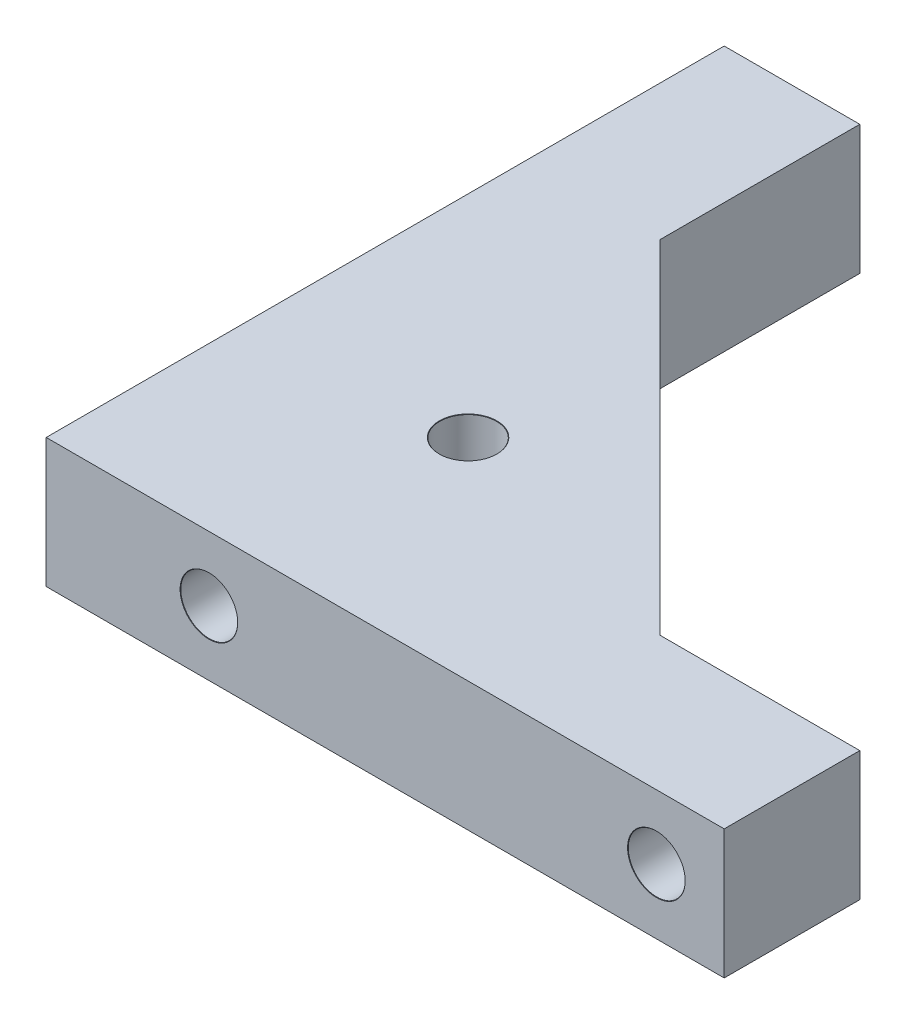
ISO-10303-21;
HEADER;
FILE_DESCRIPTION(('STEP AP214'),'2;1');
FILE_NAME('part.step','',(''),(''),'','','');
FILE_SCHEMA(('AUTOMOTIVE_DESIGN { 1 0 10303 214 1 1 1 1 }'));
ENDSEC;
DATA;
#1=APPLICATION_CONTEXT('core data for automotive mechanical design processes');
#2=APPLICATION_PROTOCOL_DEFINITION('international standard','automotive_design',2000,#1);
#3=PRODUCT_CONTEXT('',#1,'mechanical');
#4=PRODUCT('Part','Part','',(#3));
#5=PRODUCT_RELATED_PRODUCT_CATEGORY('part','',(#4));
#6=PRODUCT_DEFINITION_FORMATION('','',#4);
#7=PRODUCT_DEFINITION_CONTEXT('part definition',#1,'design');
#8=PRODUCT_DEFINITION('design','',#6,#7);
#9=PRODUCT_DEFINITION_SHAPE('','',#8);
#10=(LENGTH_UNIT() NAMED_UNIT(*) SI_UNIT(.MILLI.,.METRE.));
#11=(NAMED_UNIT(*) PLANE_ANGLE_UNIT() SI_UNIT($,.RADIAN.));
#12=(NAMED_UNIT(*) SI_UNIT($,.STERADIAN.) SOLID_ANGLE_UNIT());
#13=UNCERTAINTY_MEASURE_WITH_UNIT(LENGTH_MEASURE(1.E-05),#10,'distance_accuracy_value','');
#14=(GEOMETRIC_REPRESENTATION_CONTEXT(3) GLOBAL_UNCERTAINTY_ASSIGNED_CONTEXT((#13)) GLOBAL_UNIT_ASSIGNED_CONTEXT((#10,
#11,#12)) REPRESENTATION_CONTEXT('',''));
#15=CARTESIAN_POINT('',(0.,0.,0.));
#16=DIRECTION('',(0.,0.,1.));
#17=DIRECTION('',(1.,0.,0.));
#18=AXIS2_PLACEMENT_3D('',#15,#16,#17);
#19=CARTESIAN_POINT('',(0.,4.7625,-50.));
#20=DIRECTION('',(1.,0.,0.));
#21=DIRECTION('',(0.,0.,-1.));
#22=AXIS2_PLACEMENT_3D('',#19,#20,#21);
#23=PLANE('',#22);
#24=CARTESIAN_POINT('',(0.,0.,-12.));
#25=DIRECTION('',(-1.,0.,0.));
#26=DIRECTION('',(0.,0.,1.));
#27=AXIS2_PLACEMENT_3D('',#24,#25,#26);
#28=CIRCLE('',#27,2.125);
#29=CARTESIAN_POINT('',(0.,0.,-9.875));
#30=VERTEX_POINT('',#29);
#31=EDGE_CURVE('E198',#30,#30,#28,.T.);
#32=ORIENTED_EDGE('',*,*,#31,.F.);
#33=EDGE_LOOP('',(#32));
#34=FACE_BOUND('',#33,.T.);
#35=CARTESIAN_POINT('',(0.,0.,-45.));
#36=DIRECTION('',(-1.,0.,0.));
#37=DIRECTION('',(0.,0.,1.));
#38=AXIS2_PLACEMENT_3D('',#35,#36,#37);
#39=CIRCLE('',#38,2.125);
#40=CARTESIAN_POINT('',(0.,0.,-42.875));
#41=VERTEX_POINT('',#40);
#42=EDGE_CURVE('E189',#41,#41,#39,.T.);
#43=ORIENTED_EDGE('',*,*,#42,.F.);
#44=EDGE_LOOP('',(#43));
#45=FACE_BOUND('',#44,.T.);
#46=DIRECTION('',(0.,0.,1.));
#47=VECTOR('',#46,1.);
#48=CARTESIAN_POINT('',(0.,-4.7625,-50.));
#49=LINE('',#48,#47);
#50=CARTESIAN_POINT('',(0.,-4.7625,-50.));
#51=VERTEX_POINT('',#50);
#52=CARTESIAN_POINT('',(0.,-4.7625,0.));
#53=VERTEX_POINT('',#52);
#54=EDGE_CURVE('E130',#51,#53,#49,.T.);
#55=ORIENTED_EDGE('',*,*,#54,.T.);
#56=DIRECTION('',(0.,-1.,0.));
#57=VECTOR('',#56,1.);
#58=CARTESIAN_POINT('',(0.,4.7625,0.));
#59=LINE('',#58,#57);
#60=CARTESIAN_POINT('',(0.,4.7625,0.));
#61=VERTEX_POINT('',#60);
#62=EDGE_CURVE('E11',#61,#53,#59,.T.);
#63=ORIENTED_EDGE('',*,*,#62,.F.);
#64=DIRECTION('',(0.,0.,1.));
#65=VECTOR('',#64,1.);
#66=CARTESIAN_POINT('',(0.,4.7625,-50.));
#67=LINE('',#66,#65);
#68=CARTESIAN_POINT('',(0.,4.7625,-50.));
#69=VERTEX_POINT('',#68);
#70=EDGE_CURVE('E143',#69,#61,#67,.T.);
#71=ORIENTED_EDGE('',*,*,#70,.F.);
#72=DIRECTION('',(0.,-1.,0.));
#73=VECTOR('',#72,1.);
#74=CARTESIAN_POINT('',(0.,4.7625,-50.));
#75=LINE('',#74,#73);
#76=EDGE_CURVE('E126',#69,#51,#75,.T.);
#77=ORIENTED_EDGE('',*,*,#76,.T.);
#78=EDGE_LOOP('',(#55,#63,#71,#77));
#79=FACE_BOUND('',#78,.T.);
#80=ADVANCED_FACE('F37',(#34,#45,#79),#23,.F.);
#81=CARTESIAN_POINT('',(0.,4.7625,0.));
#82=DIRECTION('',(0.,0.,-1.));
#83=DIRECTION('',(-1.,0.,0.));
#84=AXIS2_PLACEMENT_3D('',#81,#82,#83);
#85=PLANE('',#84);
#86=CARTESIAN_POINT('',(12.,0.,0.));
#87=DIRECTION('',(0.,0.,1.));
#88=DIRECTION('',(1.,0.,0.));
#89=AXIS2_PLACEMENT_3D('',#86,#87,#88);
#90=CIRCLE('',#89,2.125);
#91=CARTESIAN_POINT('',(14.125,0.,0.));
#92=VERTEX_POINT('',#91);
#93=EDGE_CURVE('E180',#92,#92,#90,.T.);
#94=ORIENTED_EDGE('',*,*,#93,.F.);
#95=EDGE_LOOP('',(#94));
#96=FACE_BOUND('',#95,.T.);
#97=CARTESIAN_POINT('',(45.,0.,0.));
#98=DIRECTION('',(0.,0.,1.));
#99=DIRECTION('',(1.,0.,0.));
#100=AXIS2_PLACEMENT_3D('',#97,#98,#99);
#101=CIRCLE('',#100,2.125);
#102=CARTESIAN_POINT('',(47.125,0.,0.));
#103=VERTEX_POINT('',#102);
#104=EDGE_CURVE('E171',#103,#103,#101,.T.);
#105=ORIENTED_EDGE('',*,*,#104,.F.);
#106=EDGE_LOOP('',(#105));
#107=FACE_BOUND('',#106,.T.);
#108=DIRECTION('',(1.,0.,0.));
#109=VECTOR('',#108,1.);
#110=CARTESIAN_POINT('',(0.,-4.7625,0.));
#111=LINE('',#110,#109);
#112=CARTESIAN_POINT('',(50.,-4.7625,0.));
#113=VERTEX_POINT('',#112);
#114=EDGE_CURVE('E133',#53,#113,#111,.T.);
#115=ORIENTED_EDGE('',*,*,#114,.T.);
#116=DIRECTION('',(0.,-1.,0.));
#117=VECTOR('',#116,1.);
#118=CARTESIAN_POINT('',(50.,4.7625,0.));
#119=LINE('',#118,#117);
#120=CARTESIAN_POINT('',(50.,4.7625,0.));
#121=VERTEX_POINT('',#120);
#122=EDGE_CURVE('E45',#121,#113,#119,.T.);
#123=ORIENTED_EDGE('',*,*,#122,.F.);
#124=DIRECTION('',(1.,0.,0.));
#125=VECTOR('',#124,1.);
#126=CARTESIAN_POINT('',(0.,4.7625,0.));
#127=LINE('',#126,#125);
#128=EDGE_CURVE('E94',#61,#121,#127,.T.);
#129=ORIENTED_EDGE('',*,*,#128,.F.);
#130=ORIENTED_EDGE('',*,*,#62,.T.);
#131=EDGE_LOOP('',(#115,#123,#129,#130));
#132=FACE_BOUND('',#131,.T.);
#133=ADVANCED_FACE('F246',(#96,#107,#132),#85,.F.);
#134=CARTESIAN_POINT('',(50.,4.7625,0.));
#135=DIRECTION('',(-1.,0.,0.));
#136=DIRECTION('',(0.,0.,1.));
#137=AXIS2_PLACEMENT_3D('',#134,#135,#136);
#138=PLANE('',#137);
#139=DIRECTION('',(0.,0.,-1.));
#140=VECTOR('',#139,1.);
#141=CARTESIAN_POINT('',(50.,-4.7625,0.));
#142=LINE('',#141,#140);
#143=CARTESIAN_POINT('',(50.,-4.7625,-10.));
#144=VERTEX_POINT('',#143);
#145=EDGE_CURVE('E136',#113,#144,#142,.T.);
#146=ORIENTED_EDGE('',*,*,#145,.T.);
#147=DIRECTION('',(0.,-1.,0.));
#148=VECTOR('',#147,1.);
#149=CARTESIAN_POINT('',(50.,4.7625,-10.));
#150=LINE('',#149,#148);
#151=CARTESIAN_POINT('',(50.,4.7625,-10.));
#152=VERTEX_POINT('',#151);
#153=EDGE_CURVE('E147',#152,#144,#150,.T.);
#154=ORIENTED_EDGE('',*,*,#153,.F.);
#155=DIRECTION('',(0.,0.,-1.));
#156=VECTOR('',#155,1.);
#157=CARTESIAN_POINT('',(50.,4.7625,0.));
#158=LINE('',#157,#156);
#159=EDGE_CURVE('E155',#121,#152,#158,.T.);
#160=ORIENTED_EDGE('',*,*,#159,.F.);
#161=ORIENTED_EDGE('',*,*,#122,.T.);
#162=EDGE_LOOP('',(#146,#154,#160,#161));
#163=FACE_BOUND('',#162,.T.);
#164=ADVANCED_FACE('F153',(#163),#138,.F.);
#165=CARTESIAN_POINT('',(50.,4.7625,-10.));
#166=DIRECTION('',(0.,0.,1.));
#167=DIRECTION('',(1.,0.,0.));
#168=AXIS2_PLACEMENT_3D('',#165,#166,#167);
#169=PLANE('',#168);
#170=DIRECTION('',(-1.,0.,0.));
#171=VECTOR('',#170,1.);
#172=CARTESIAN_POINT('',(50.,-4.7625,-10.));
#173=LINE('',#172,#171);
#174=CARTESIAN_POINT('',(35.254833995939,-4.7625,-10.));
#175=VERTEX_POINT('',#174);
#176=EDGE_CURVE('E138',#144,#175,#173,.T.);
#177=ORIENTED_EDGE('',*,*,#176,.T.);
#178=DIRECTION('',(0.,-1.,0.));
#179=VECTOR('',#178,1.);
#180=CARTESIAN_POINT('',(35.254833995939,4.7625,-10.));
#181=LINE('',#180,#179);
#182=CARTESIAN_POINT('',(35.254833995939,4.7625,-10.));
#183=VERTEX_POINT('',#182);
#184=EDGE_CURVE('E121',#183,#175,#181,.T.);
#185=ORIENTED_EDGE('',*,*,#184,.F.);
#186=DIRECTION('',(-1.,0.,0.));
#187=VECTOR('',#186,1.);
#188=CARTESIAN_POINT('',(50.,4.7625,-10.));
#189=LINE('',#188,#187);
#190=EDGE_CURVE('E112',#152,#183,#189,.T.);
#191=ORIENTED_EDGE('',*,*,#190,.F.);
#192=ORIENTED_EDGE('',*,*,#153,.T.);
#193=EDGE_LOOP('',(#177,#185,#191,#192));
#194=FACE_BOUND('',#193,.T.);
#195=ADVANCED_FACE('F161',(#194),#169,.F.);
#196=CARTESIAN_POINT('',(35.254833995939,4.7625,-10.));
#197=DIRECTION('',(-0.707106781186547,0.,0.707106781186547));
#198=DIRECTION('',(0.707106781186548,0.,0.707106781186548));
#199=AXIS2_PLACEMENT_3D('',#196,#197,#198);
#200=PLANE('',#199);
#201=DIRECTION('',(-0.707106781186547,0.,-0.707106781186547));
#202=VECTOR('',#201,1.);
#203=CARTESIAN_POINT('',(35.254833995939,-4.7625,-10.));
#204=LINE('',#203,#202);
#205=CARTESIAN_POINT('',(10.,-4.7625,-35.254833995939));
#206=VERTEX_POINT('',#205);
#207=EDGE_CURVE('E120',#175,#206,#204,.T.);
#208=ORIENTED_EDGE('',*,*,#207,.T.);
#209=DIRECTION('',(0.,-1.,0.));
#210=VECTOR('',#209,1.);
#211=CARTESIAN_POINT('',(10.,4.7625,-35.254833995939));
#212=LINE('',#211,#210);
#213=CARTESIAN_POINT('',(10.,4.7625,-35.254833995939));
#214=VERTEX_POINT('',#213);
#215=EDGE_CURVE('E117',#214,#206,#212,.T.);
#216=ORIENTED_EDGE('',*,*,#215,.F.);
#217=DIRECTION('',(-0.707106781186547,0.,-0.707106781186547));
#218=VECTOR('',#217,1.);
#219=CARTESIAN_POINT('',(35.254833995939,4.7625,-10.));
#220=LINE('',#219,#218);
#221=EDGE_CURVE('E106',#183,#214,#220,.T.);
#222=ORIENTED_EDGE('',*,*,#221,.F.);
#223=ORIENTED_EDGE('',*,*,#184,.T.);
#224=EDGE_LOOP('',(#208,#216,#222,#223));
#225=FACE_BOUND('',#224,.T.);
#226=ADVANCED_FACE('F118',(#225),#200,.F.);
#227=CARTESIAN_POINT('',(10.,4.7625,-35.254833995939));
#228=DIRECTION('',(-1.,0.,0.));
#229=DIRECTION('',(0.,0.,1.));
#230=AXIS2_PLACEMENT_3D('',#227,#228,#229);
#231=PLANE('',#230);
#232=DIRECTION('',(0.,0.,-1.));
#233=VECTOR('',#232,1.);
#234=CARTESIAN_POINT('',(10.,-4.7625,-35.254833995939));
#235=LINE('',#234,#233);
#236=CARTESIAN_POINT('',(10.,-4.7625,-50.));
#237=VERTEX_POINT('',#236);
#238=EDGE_CURVE('E80',#206,#237,#235,.T.);
#239=ORIENTED_EDGE('',*,*,#238,.T.);
#240=DIRECTION('',(0.,-1.,0.));
#241=VECTOR('',#240,1.);
#242=CARTESIAN_POINT('',(10.,4.7625,-50.));
#243=LINE('',#242,#241);
#244=CARTESIAN_POINT('',(10.,4.7625,-50.));
#245=VERTEX_POINT('',#244);
#246=EDGE_CURVE('E122',#245,#237,#243,.T.);
#247=ORIENTED_EDGE('',*,*,#246,.F.);
#248=DIRECTION('',(0.,0.,-1.));
#249=VECTOR('',#248,1.);
#250=CARTESIAN_POINT('',(10.,4.7625,-35.254833995939));
#251=LINE('',#250,#249);
#252=EDGE_CURVE('E110',#214,#245,#251,.T.);
#253=ORIENTED_EDGE('',*,*,#252,.F.);
#254=ORIENTED_EDGE('',*,*,#215,.T.);
#255=EDGE_LOOP('',(#239,#247,#253,#254));
#256=FACE_BOUND('',#255,.T.);
#257=ADVANCED_FACE('F124',(#256),#231,.F.);
#258=CARTESIAN_POINT('',(10.,4.7625,-50.));
#259=DIRECTION('',(0.,0.,1.));
#260=DIRECTION('',(1.,0.,0.));
#261=AXIS2_PLACEMENT_3D('',#258,#259,#260);
#262=PLANE('',#261);
#263=DIRECTION('',(-1.,0.,0.));
#264=VECTOR('',#263,1.);
#265=CARTESIAN_POINT('',(10.,-4.7625,-50.));
#266=LINE('',#265,#264);
#267=EDGE_CURVE('E86',#237,#51,#266,.T.);
#268=ORIENTED_EDGE('',*,*,#267,.T.);
#269=ORIENTED_EDGE('',*,*,#76,.F.);
#270=DIRECTION('',(-1.,0.,0.));
#271=VECTOR('',#270,1.);
#272=CARTESIAN_POINT('',(10.,4.7625,-50.));
#273=LINE('',#272,#271);
#274=EDGE_CURVE('E53',#245,#69,#273,.T.);
#275=ORIENTED_EDGE('',*,*,#274,.F.);
#276=ORIENTED_EDGE('',*,*,#246,.T.);
#277=EDGE_LOOP('',(#268,#269,#275,#276));
#278=FACE_BOUND('',#277,.T.);
#279=ADVANCED_FACE('F235',(#278),#262,.F.);
#280=CARTESIAN_POINT('',(0.,4.7625,0.));
#281=DIRECTION('',(0.,1.,0.));
#282=DIRECTION('',(0.,0.,1.));
#283=AXIS2_PLACEMENT_3D('',#280,#281,#282);
#284=PLANE('',#283);
#285=CARTESIAN_POINT('',(15.556349186104,4.7625,-15.5563491861041));
#286=DIRECTION('',(0.,1.,0.));
#287=DIRECTION('',(0.,0.,1.));
#288=AXIS2_PLACEMENT_3D('',#285,#286,#287);
#289=CIRCLE('',#288,2.125);
#290=CARTESIAN_POINT('',(15.556349186104,4.7625,-13.431349186104));
#291=VERTEX_POINT('',#290);
#292=EDGE_CURVE('E207',#291,#291,#289,.T.);
#293=ORIENTED_EDGE('',*,*,#292,.F.);
#294=EDGE_LOOP('',(#293));
#295=FACE_BOUND('',#294,.T.);
#296=ORIENTED_EDGE('',*,*,#70,.T.);
#297=ORIENTED_EDGE('',*,*,#128,.T.);
#298=ORIENTED_EDGE('',*,*,#159,.T.);
#299=ORIENTED_EDGE('',*,*,#190,.T.);
#300=ORIENTED_EDGE('',*,*,#221,.T.);
#301=ORIENTED_EDGE('',*,*,#252,.T.);
#302=ORIENTED_EDGE('',*,*,#274,.T.);
#303=EDGE_LOOP('',(#296,#297,#298,#299,#300,#301,#302));
#304=FACE_BOUND('',#303,.T.);
#305=ADVANCED_FACE('F108',(#295,#304),#284,.T.);
#306=CARTESIAN_POINT('',(0.,-4.7625,0.));
#307=DIRECTION('',(0.,1.,0.));
#308=DIRECTION('',(0.,0.,1.));
#309=AXIS2_PLACEMENT_3D('',#306,#307,#308);
#310=PLANE('',#309);
#311=CARTESIAN_POINT('',(15.556349186104,-4.7625,-15.5563491861041));
#312=DIRECTION('',(0.,1.,0.));
#313=DIRECTION('',(0.,0.,1.));
#314=AXIS2_PLACEMENT_3D('',#311,#312,#313);
#315=CIRCLE('',#314,2.125);
#316=CARTESIAN_POINT('',(15.556349186104,-4.7625,-13.4313491861041));
#317=VERTEX_POINT('',#316);
#318=EDGE_CURVE('E210',#317,#317,#315,.T.);
#319=ORIENTED_EDGE('',*,*,#318,.T.);
#320=EDGE_LOOP('',(#319));
#321=FACE_BOUND('',#320,.T.);
#322=ORIENTED_EDGE('',*,*,#54,.F.);
#323=ORIENTED_EDGE('',*,*,#267,.F.);
#324=ORIENTED_EDGE('',*,*,#238,.F.);
#325=ORIENTED_EDGE('',*,*,#207,.F.);
#326=ORIENTED_EDGE('',*,*,#176,.F.);
#327=ORIENTED_EDGE('',*,*,#145,.F.);
#328=ORIENTED_EDGE('',*,*,#114,.F.);
#329=EDGE_LOOP('',(#322,#323,#324,#325,#326,#327,#328));
#330=FACE_BOUND('',#329,.T.);
#331=ADVANCED_FACE('F159',(#321,#330),#310,.F.);
#332=CARTESIAN_POINT('',(45.,0.,-8.));
#333=DIRECTION('',(0.,0.,1.));
#334=DIRECTION('',(1.,0.,0.));
#335=AXIS2_PLACEMENT_3D('',#332,#333,#334);
#336=CONICAL_SURFACE('',#335,2.1,1.02974425867665);
#337=CARTESIAN_POINT('',(45.,0.,-9.26180729995788));
#338=VERTEX_POINT('',#337);
#339=VERTEX_LOOP('',#338);
#340=FACE_BOUND('',#339,.T.);
#341=CARTESIAN_POINT('',(45.,0.,-8.));
#342=DIRECTION('',(0.,0.,1.));
#343=DIRECTION('',(1.,0.,0.));
#344=AXIS2_PLACEMENT_3D('',#341,#342,#343);
#345=CIRCLE('',#344,2.1);
#346=CARTESIAN_POINT('',(47.1,0.,-8.));
#347=VERTEX_POINT('',#346);
#348=EDGE_CURVE('E134',#347,#347,#345,.T.);
#349=ORIENTED_EDGE('',*,*,#348,.T.);
#350=EDGE_LOOP('',(#349));
#351=FACE_BOUND('',#350,.T.);
#352=ADVANCED_FACE('F241',(#340,#351),#336,.F.);
#353=CARTESIAN_POINT('',(45.,0.,0.));
#354=DIRECTION('',(0.,0.,1.));
#355=DIRECTION('',(1.,0.,0.));
#356=AXIS2_PLACEMENT_3D('',#353,#354,#355);
#357=CYLINDRICAL_SURFACE('',#356,2.1);
#358=ORIENTED_EDGE('',*,*,#348,.F.);
#359=EDGE_LOOP('',(#358));
#360=FACE_BOUND('',#359,.T.);
#361=CARTESIAN_POINT('',(45.,0.,-0.0250000000000007));
#362=DIRECTION('',(0.,0.,1.));
#363=DIRECTION('',(1.,0.,0.));
#364=AXIS2_PLACEMENT_3D('',#361,#362,#363);
#365=CIRCLE('',#364,2.1);
#366=CARTESIAN_POINT('',(47.1,0.,-0.0250000000000007));
#367=VERTEX_POINT('',#366);
#368=EDGE_CURVE('E168',#367,#367,#365,.T.);
#369=ORIENTED_EDGE('',*,*,#368,.T.);
#370=EDGE_LOOP('',(#369));
#371=FACE_BOUND('',#370,.T.);
#372=ADVANCED_FACE('F296',(#360,#371),#357,.F.);
#373=CARTESIAN_POINT('',(45.,0.,0.));
#374=DIRECTION('',(0.,0.,1.));
#375=DIRECTION('',(1.,0.,0.));
#376=AXIS2_PLACEMENT_3D('',#373,#374,#375);
#377=CONICAL_SURFACE('',#376,2.125,0.785398163397483);
#378=ORIENTED_EDGE('',*,*,#368,.F.);
#379=EDGE_LOOP('',(#378));
#380=FACE_BOUND('',#379,.T.);
#381=ORIENTED_EDGE('',*,*,#104,.T.);
#382=EDGE_LOOP('',(#381));
#383=FACE_BOUND('',#382,.T.);
#384=ADVANCED_FACE('F292',(#380,#383),#377,.F.);
#385=CARTESIAN_POINT('',(12.,0.,-8.));
#386=DIRECTION('',(0.,0.,1.));
#387=DIRECTION('',(1.,0.,0.));
#388=AXIS2_PLACEMENT_3D('',#385,#386,#387);
#389=CONICAL_SURFACE('',#388,2.1,1.02974425867665);
#390=CARTESIAN_POINT('',(12.,0.,-9.26180729995788));
#391=VERTEX_POINT('',#390);
#392=VERTEX_LOOP('',#391);
#393=FACE_BOUND('',#392,.T.);
#394=CARTESIAN_POINT('',(12.,0.,-8.));
#395=DIRECTION('',(0.,0.,1.));
#396=DIRECTION('',(1.,0.,0.));
#397=AXIS2_PLACEMENT_3D('',#394,#395,#396);
#398=CIRCLE('',#397,2.1);
#399=CARTESIAN_POINT('',(14.1,0.,-8.));
#400=VERTEX_POINT('',#399);
#401=EDGE_CURVE('E174',#400,#400,#398,.T.);
#402=ORIENTED_EDGE('',*,*,#401,.T.);
#403=EDGE_LOOP('',(#402));
#404=FACE_BOUND('',#403,.T.);
#405=ADVANCED_FACE('F288',(#393,#404),#389,.F.);
#406=CARTESIAN_POINT('',(12.,0.,0.));
#407=DIRECTION('',(0.,0.,1.));
#408=DIRECTION('',(1.,0.,0.));
#409=AXIS2_PLACEMENT_3D('',#406,#407,#408);
#410=CYLINDRICAL_SURFACE('',#409,2.1);
#411=ORIENTED_EDGE('',*,*,#401,.F.);
#412=EDGE_LOOP('',(#411));
#413=FACE_BOUND('',#412,.T.);
#414=CARTESIAN_POINT('',(12.,0.,-0.0250000000000007));
#415=DIRECTION('',(0.,0.,1.));
#416=DIRECTION('',(1.,0.,0.));
#417=AXIS2_PLACEMENT_3D('',#414,#415,#416);
#418=CIRCLE('',#417,2.1);
#419=CARTESIAN_POINT('',(14.1,0.,-0.0250000000000007));
#420=VERTEX_POINT('',#419);
#421=EDGE_CURVE('E177',#420,#420,#418,.T.);
#422=ORIENTED_EDGE('',*,*,#421,.T.);
#423=EDGE_LOOP('',(#422));
#424=FACE_BOUND('',#423,.T.);
#425=ADVANCED_FACE('F284',(#413,#424),#410,.F.);
#426=CARTESIAN_POINT('',(12.,0.,0.));
#427=DIRECTION('',(0.,0.,1.));
#428=DIRECTION('',(1.,0.,0.));
#429=AXIS2_PLACEMENT_3D('',#426,#427,#428);
#430=CONICAL_SURFACE('',#429,2.125,0.785398163397414);
#431=ORIENTED_EDGE('',*,*,#421,.F.);
#432=EDGE_LOOP('',(#431));
#433=FACE_BOUND('',#432,.T.);
#434=ORIENTED_EDGE('',*,*,#93,.T.);
#435=EDGE_LOOP('',(#434));
#436=FACE_BOUND('',#435,.T.);
#437=ADVANCED_FACE('F280',(#433,#436),#430,.F.);
#438=CARTESIAN_POINT('',(8.00000000000001,0.,-45.));
#439=DIRECTION('',(-1.,0.,0.));
#440=DIRECTION('',(0.,0.,1.));
#441=AXIS2_PLACEMENT_3D('',#438,#439,#440);
#442=CONICAL_SURFACE('',#441,2.1,1.02974425867665);
#443=CARTESIAN_POINT('',(9.26180729995789,0.,-45.));
#444=VERTEX_POINT('',#443);
#445=VERTEX_LOOP('',#444);
#446=FACE_BOUND('',#445,.T.);
#447=CARTESIAN_POINT('',(8.00000000000001,0.,-45.));
#448=DIRECTION('',(-1.,0.,0.));
#449=DIRECTION('',(0.,0.,1.));
#450=AXIS2_PLACEMENT_3D('',#447,#448,#449);
#451=CIRCLE('',#450,2.1);
#452=CARTESIAN_POINT('',(8.00000000000001,0.,-42.9));
#453=VERTEX_POINT('',#452);
#454=EDGE_CURVE('E183',#453,#453,#451,.T.);
#455=ORIENTED_EDGE('',*,*,#454,.T.);
#456=EDGE_LOOP('',(#455));
#457=FACE_BOUND('',#456,.T.);
#458=ADVANCED_FACE('F272',(#446,#457),#442,.F.);
#459=CARTESIAN_POINT('',(0.,0.,-45.));
#460=DIRECTION('',(-1.,0.,0.));
#461=DIRECTION('',(0.,0.,1.));
#462=AXIS2_PLACEMENT_3D('',#459,#460,#461);
#463=CYLINDRICAL_SURFACE('',#462,2.1);
#464=ORIENTED_EDGE('',*,*,#454,.F.);
#465=EDGE_LOOP('',(#464));
#466=FACE_BOUND('',#465,.T.);
#467=CARTESIAN_POINT('',(0.0250000000000107,0.,-45.));
#468=DIRECTION('',(-1.,0.,0.));
#469=DIRECTION('',(0.,0.,1.));
#470=AXIS2_PLACEMENT_3D('',#467,#468,#469);
#471=CIRCLE('',#470,2.1);
#472=CARTESIAN_POINT('',(0.0250000000000098,0.,-42.9));
#473=VERTEX_POINT('',#472);
#474=EDGE_CURVE('E186',#473,#473,#471,.T.);
#475=ORIENTED_EDGE('',*,*,#474,.T.);
#476=EDGE_LOOP('',(#475));
#477=FACE_BOUND('',#476,.T.);
#478=ADVANCED_FACE('F262',(#466,#477),#463,.F.);
#479=CARTESIAN_POINT('',(0.,0.,-45.));
#480=DIRECTION('',(-1.,0.,0.));
#481=DIRECTION('',(0.,0.,1.));
#482=AXIS2_PLACEMENT_3D('',#479,#480,#481);
#483=CONICAL_SURFACE('',#482,2.125,0.785398163397405);
#484=ORIENTED_EDGE('',*,*,#474,.F.);
#485=EDGE_LOOP('',(#484));
#486=FACE_BOUND('',#485,.T.);
#487=ORIENTED_EDGE('',*,*,#42,.T.);
#488=EDGE_LOOP('',(#487));
#489=FACE_BOUND('',#488,.T.);
#490=ADVANCED_FACE('F259',(#486,#489),#483,.F.);
#491=CARTESIAN_POINT('',(8.,0.,-12.));
#492=DIRECTION('',(-1.,0.,0.));
#493=DIRECTION('',(0.,0.,1.));
#494=AXIS2_PLACEMENT_3D('',#491,#492,#493);
#495=CONICAL_SURFACE('',#494,2.1,1.02974425867665);
#496=CARTESIAN_POINT('',(9.26180729995788,0.,-12.));
#497=VERTEX_POINT('',#496);
#498=VERTEX_LOOP('',#497);
#499=FACE_BOUND('',#498,.T.);
#500=CARTESIAN_POINT('',(8.,0.,-12.));
#501=DIRECTION('',(-1.,0.,0.));
#502=DIRECTION('',(0.,0.,1.));
#503=AXIS2_PLACEMENT_3D('',#500,#501,#502);
#504=CIRCLE('',#503,2.1);
#505=CARTESIAN_POINT('',(8.,0.,-9.9));
#506=VERTEX_POINT('',#505);
#507=EDGE_CURVE('E192',#506,#506,#504,.T.);
#508=ORIENTED_EDGE('',*,*,#507,.T.);
#509=EDGE_LOOP('',(#508));
#510=FACE_BOUND('',#509,.T.);
#511=ADVANCED_FACE('F261',(#499,#510),#495,.F.);
#512=CARTESIAN_POINT('',(0.,0.,-12.));
#513=DIRECTION('',(-1.,0.,0.));
#514=DIRECTION('',(0.,0.,1.));
#515=AXIS2_PLACEMENT_3D('',#512,#513,#514);
#516=CYLINDRICAL_SURFACE('',#515,2.1);
#517=ORIENTED_EDGE('',*,*,#507,.F.);
#518=EDGE_LOOP('',(#517));
#519=FACE_BOUND('',#518,.T.);
#520=CARTESIAN_POINT('',(0.0250000000000034,0.,-12.));
#521=DIRECTION('',(-1.,0.,0.));
#522=DIRECTION('',(0.,0.,1.));
#523=AXIS2_PLACEMENT_3D('',#520,#521,#522);
#524=CIRCLE('',#523,2.1);
#525=CARTESIAN_POINT('',(0.0250000000000024,0.,-9.9));
#526=VERTEX_POINT('',#525);
#527=EDGE_CURVE('E195',#526,#526,#524,.T.);
#528=ORIENTED_EDGE('',*,*,#527,.T.);
#529=EDGE_LOOP('',(#528));
#530=FACE_BOUND('',#529,.T.);
#531=ADVANCED_FACE('F269',(#519,#530),#516,.F.);
#532=CARTESIAN_POINT('',(0.,0.,-12.));
#533=DIRECTION('',(-1.,0.,0.));
#534=DIRECTION('',(0.,0.,1.));
#535=AXIS2_PLACEMENT_3D('',#532,#533,#534);
#536=CONICAL_SURFACE('',#535,2.125,0.785398163397405);
#537=ORIENTED_EDGE('',*,*,#527,.F.);
#538=EDGE_LOOP('',(#537));
#539=FACE_BOUND('',#538,.T.);
#540=ORIENTED_EDGE('',*,*,#31,.T.);
#541=EDGE_LOOP('',(#540));
#542=FACE_BOUND('',#541,.T.);
#543=ADVANCED_FACE('F219',(#539,#542),#536,.F.);
#544=CARTESIAN_POINT('',(15.556349186104,-4.7375,-15.5563491861041));
#545=DIRECTION('',(0.,-1.,0.));
#546=DIRECTION('',(0.,0.,-1.));
#547=AXIS2_PLACEMENT_3D('',#544,#545,#546);
#548=CONICAL_SURFACE('',#547,2.1,0.785398163397448);
#549=ORIENTED_EDGE('',*,*,#318,.F.);
#550=EDGE_LOOP('',(#549));
#551=FACE_BOUND('',#550,.T.);
#552=CARTESIAN_POINT('',(15.556349186104,-4.7375,-15.5563491861041));
#553=DIRECTION('',(0.,1.,0.));
#554=DIRECTION('',(0.,0.,1.));
#555=AXIS2_PLACEMENT_3D('',#552,#553,#554);
#556=CIRCLE('',#555,2.1);
#557=CARTESIAN_POINT('',(15.556349186104,-4.7375,-13.4563491861041));
#558=VERTEX_POINT('',#557);
#559=EDGE_CURVE('E201',#558,#558,#556,.T.);
#560=ORIENTED_EDGE('',*,*,#559,.T.);
#561=EDGE_LOOP('',(#560));
#562=FACE_BOUND('',#561,.T.);
#563=ADVANCED_FACE('F215',(#551,#562),#548,.F.);
#564=CARTESIAN_POINT('',(15.556349186104,4.7625,-15.5563491861041));
#565=DIRECTION('',(0.,1.,0.));
#566=DIRECTION('',(0.,0.,1.));
#567=AXIS2_PLACEMENT_3D('',#564,#565,#566);
#568=CYLINDRICAL_SURFACE('',#567,2.1);
#569=ORIENTED_EDGE('',*,*,#559,.F.);
#570=EDGE_LOOP('',(#569));
#571=FACE_BOUND('',#570,.T.);
#572=CARTESIAN_POINT('',(15.556349186104,4.7375,-15.5563491861041));
#573=DIRECTION('',(0.,1.,0.));
#574=DIRECTION('',(0.,0.,1.));
#575=AXIS2_PLACEMENT_3D('',#572,#573,#574);
#576=CIRCLE('',#575,2.1);
#577=CARTESIAN_POINT('',(15.556349186104,4.7375,-13.4563491861041));
#578=VERTEX_POINT('',#577);
#579=EDGE_CURVE('E204',#578,#578,#576,.T.);
#580=ORIENTED_EDGE('',*,*,#579,.T.);
#581=EDGE_LOOP('',(#580));
#582=FACE_BOUND('',#581,.T.);
#583=ADVANCED_FACE('F218',(#571,#582),#568,.F.);
#584=CARTESIAN_POINT('',(15.556349186104,4.7625,-15.5563491861041));
#585=DIRECTION('',(0.,1.,0.));
#586=DIRECTION('',(0.,0.,1.));
#587=AXIS2_PLACEMENT_3D('',#584,#585,#586);
#588=CONICAL_SURFACE('',#587,2.125,0.785398163397431);
#589=ORIENTED_EDGE('',*,*,#579,.F.);
#590=EDGE_LOOP('',(#589));
#591=FACE_BOUND('',#590,.T.);
#592=ORIENTED_EDGE('',*,*,#292,.T.);
#593=EDGE_LOOP('',(#592));
#594=FACE_BOUND('',#593,.T.);
#595=ADVANCED_FACE('F225',(#591,#594),#588,.F.);
#596=CLOSED_SHELL('',(#80,#133,#164,#195,#226,#257,#279,#305,#331,#352,#372,#384,#405,#425,#437,
#458,#478,#490,#511,#531,#543,#563,#583,#595));
#597=MANIFOLD_SOLID_BREP('B2',#596);
#598=ADVANCED_BREP_SHAPE_REPRESENTATION('',(#18,#597),#14);
#599=SHAPE_DEFINITION_REPRESENTATION(#9,#598);
ENDSEC;
END-ISO-10303-21;
